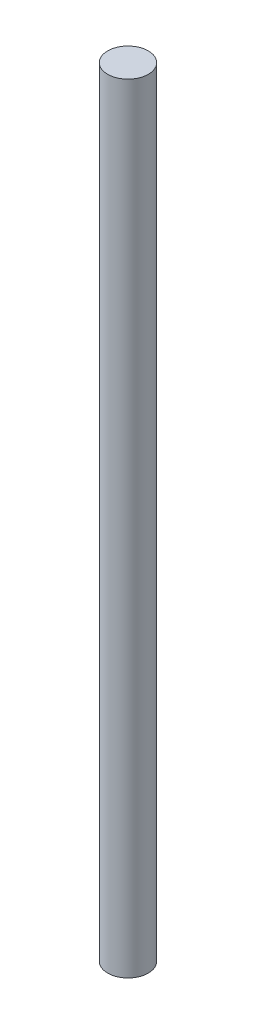
ISO-10303-21;
HEADER;
FILE_DESCRIPTION(('STEP AP214'),'2;1');
FILE_NAME('part.step','',(''),(''),'','','');
FILE_SCHEMA(('AUTOMOTIVE_DESIGN { 1 0 10303 214 1 1 1 1 }'));
ENDSEC;
DATA;
#1=APPLICATION_CONTEXT('core data for automotive mechanical design processes');
#2=APPLICATION_PROTOCOL_DEFINITION('international standard','automotive_design',2000,#1);
#3=PRODUCT_CONTEXT('',#1,'mechanical');
#4=PRODUCT('Part','Part','',(#3));
#5=PRODUCT_RELATED_PRODUCT_CATEGORY('part','',(#4));
#6=PRODUCT_DEFINITION_FORMATION('','',#4);
#7=PRODUCT_DEFINITION_CONTEXT('part definition',#1,'design');
#8=PRODUCT_DEFINITION('design','',#6,#7);
#9=PRODUCT_DEFINITION_SHAPE('','',#8);
#10=(LENGTH_UNIT() NAMED_UNIT(*) SI_UNIT(.MILLI.,.METRE.));
#11=(NAMED_UNIT(*) PLANE_ANGLE_UNIT() SI_UNIT($,.RADIAN.));
#12=(NAMED_UNIT(*) SI_UNIT($,.STERADIAN.) SOLID_ANGLE_UNIT());
#13=UNCERTAINTY_MEASURE_WITH_UNIT(LENGTH_MEASURE(1.E-05),#10,'distance_accuracy_value','');
#14=(GEOMETRIC_REPRESENTATION_CONTEXT(3) GLOBAL_UNCERTAINTY_ASSIGNED_CONTEXT((#13)) GLOBAL_UNIT_ASSIGNED_CONTEXT((#10,
#11,#12)) REPRESENTATION_CONTEXT('',''));
#15=CARTESIAN_POINT('',(0.,0.,0.));
#16=DIRECTION('',(0.,0.,1.));
#17=DIRECTION('',(1.,0.,0.));
#18=AXIS2_PLACEMENT_3D('',#15,#16,#17);
#19=CARTESIAN_POINT('',(0.,230.,0.));
#20=DIRECTION('',(0.,-1.,0.));
#21=DIRECTION('',(0.,0.,-1.));
#22=AXIS2_PLACEMENT_3D('',#19,#20,#21);
#23=CYLINDRICAL_SURFACE('',#22,6.);
#24=CARTESIAN_POINT('',(0.,230.,0.));
#25=DIRECTION('',(0.,1.,0.));
#26=DIRECTION('',(0.,0.,1.));
#27=AXIS2_PLACEMENT_3D('',#24,#25,#26);
#28=CIRCLE('',#27,6.);
#29=CARTESIAN_POINT('',(0.,230.,6.));
#30=VERTEX_POINT('',#29);
#31=EDGE_CURVE('E10',#30,#30,#28,.T.);
#32=ORIENTED_EDGE('',*,*,#31,.F.);
#33=EDGE_LOOP('',(#32));
#34=FACE_BOUND('',#33,.T.);
#35=CARTESIAN_POINT('',(0.,0.,0.));
#36=DIRECTION('',(0.,1.,0.));
#37=DIRECTION('',(0.,0.,1.));
#38=AXIS2_PLACEMENT_3D('',#35,#36,#37);
#39=CIRCLE('',#38,6.);
#40=CARTESIAN_POINT('',(0.,0.,6.));
#41=VERTEX_POINT('',#40);
#42=EDGE_CURVE('E38',#41,#41,#39,.T.);
#43=ORIENTED_EDGE('',*,*,#42,.T.);
#44=EDGE_LOOP('',(#43));
#45=FACE_BOUND('',#44,.T.);
#46=ADVANCED_FACE('F35',(#34,#45),#23,.T.);
#47=CARTESIAN_POINT('',(0.,230.,0.));
#48=DIRECTION('',(0.,1.,0.));
#49=DIRECTION('',(0.,0.,1.));
#50=AXIS2_PLACEMENT_3D('',#47,#48,#49);
#51=PLANE('',#50);
#52=ORIENTED_EDGE('',*,*,#31,.T.);
#53=EDGE_LOOP('',(#52));
#54=FACE_BOUND('',#53,.T.);
#55=ADVANCED_FACE('F54',(#54),#51,.T.);
#56=CARTESIAN_POINT('',(0.,0.,0.));
#57=DIRECTION('',(0.,1.,0.));
#58=DIRECTION('',(0.,0.,1.));
#59=AXIS2_PLACEMENT_3D('',#56,#57,#58);
#60=PLANE('',#59);
#61=ORIENTED_EDGE('',*,*,#42,.F.);
#62=EDGE_LOOP('',(#61));
#63=FACE_BOUND('',#62,.T.);
#64=ADVANCED_FACE('F52',(#63),#60,.F.);
#65=CLOSED_SHELL('',(#46,#55,#64));
#66=MANIFOLD_SOLID_BREP('B2',#65);
#67=ADVANCED_BREP_SHAPE_REPRESENTATION('',(#18,#66),#14);
#68=SHAPE_DEFINITION_REPRESENTATION(#9,#67);
ENDSEC;
END-ISO-10303-21;
